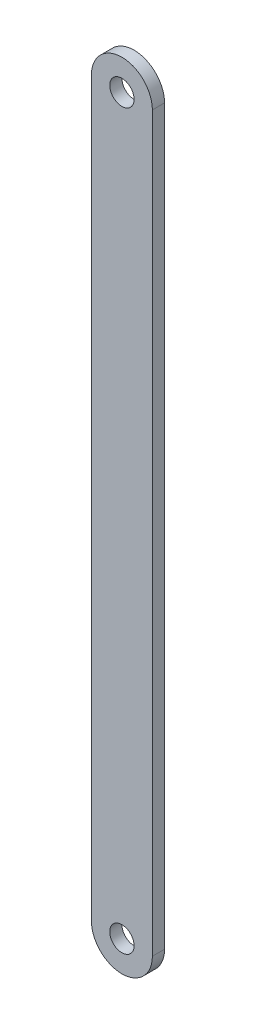
ISO-10303-21;
HEADER;
FILE_DESCRIPTION(('STEP AP214'),'2;1');
FILE_NAME('part.step','',(''),(''),'','','');
FILE_SCHEMA(('AUTOMOTIVE_DESIGN { 1 0 10303 214 1 1 1 1 }'));
ENDSEC;
DATA;
#1=APPLICATION_CONTEXT('core data for automotive mechanical design processes');
#2=APPLICATION_PROTOCOL_DEFINITION('international standard','automotive_design',2000,#1);
#3=PRODUCT_CONTEXT('',#1,'mechanical');
#4=PRODUCT('Part','Part','',(#3));
#5=PRODUCT_RELATED_PRODUCT_CATEGORY('part','',(#4));
#6=PRODUCT_DEFINITION_FORMATION('','',#4);
#7=PRODUCT_DEFINITION_CONTEXT('part definition',#1,'design');
#8=PRODUCT_DEFINITION('design','',#6,#7);
#9=PRODUCT_DEFINITION_SHAPE('','',#8);
#10=(LENGTH_UNIT() NAMED_UNIT(*) SI_UNIT(.MILLI.,.METRE.));
#11=(NAMED_UNIT(*) PLANE_ANGLE_UNIT() SI_UNIT($,.RADIAN.));
#12=(NAMED_UNIT(*) SI_UNIT($,.STERADIAN.) SOLID_ANGLE_UNIT());
#13=UNCERTAINTY_MEASURE_WITH_UNIT(LENGTH_MEASURE(1.E-05),#10,'distance_accuracy_value','');
#14=(GEOMETRIC_REPRESENTATION_CONTEXT(3) GLOBAL_UNCERTAINTY_ASSIGNED_CONTEXT((#13)) GLOBAL_UNIT_ASSIGNED_CONTEXT((#10,
#11,#12)) REPRESENTATION_CONTEXT('',''));
#15=CARTESIAN_POINT('',(0.,0.,0.));
#16=DIRECTION('',(0.,0.,1.));
#17=DIRECTION('',(1.,0.,0.));
#18=AXIS2_PLACEMENT_3D('',#15,#16,#17);
#19=CARTESIAN_POINT('',(25.,0.,10.));
#20=DIRECTION('',(0.,0.,1.));
#21=DIRECTION('',(1.,0.,0.));
#22=AXIS2_PLACEMENT_3D('',#19,#20,#21);
#23=PLANE('',#22);
#24=CARTESIAN_POINT('',(25.,601.7,10.));
#25=DIRECTION('',(0.,0.,1.));
#26=DIRECTION('',(1.,0.,0.));
#27=AXIS2_PLACEMENT_3D('',#24,#25,#26);
#28=CIRCLE('',#27,10.);
#29=CARTESIAN_POINT('',(35.,601.7,10.));
#30=VERTEX_POINT('',#29);
#31=EDGE_CURVE('E100',#30,#30,#28,.T.);
#32=ORIENTED_EDGE('',*,*,#31,.F.);
#33=EDGE_LOOP('',(#32));
#34=FACE_BOUND('',#33,.T.);
#35=CARTESIAN_POINT('',(25.,0.,10.));
#36=DIRECTION('',(0.,0.,1.));
#37=DIRECTION('',(1.,0.,0.));
#38=AXIS2_PLACEMENT_3D('',#35,#36,#37);
#39=CIRCLE('',#38,25.);
#40=CARTESIAN_POINT('',(0.,0.,10.));
#41=VERTEX_POINT('',#40);
#42=CARTESIAN_POINT('',(50.,0.,10.));
#43=VERTEX_POINT('',#42);
#44=EDGE_CURVE('E85',#41,#43,#39,.T.);
#45=ORIENTED_EDGE('',*,*,#44,.T.);
#46=DIRECTION('',(0.,1.,0.));
#47=VECTOR('',#46,1.);
#48=CARTESIAN_POINT('',(50.,0.,10.));
#49=LINE('',#48,#47);
#50=CARTESIAN_POINT('',(50.0000000000001,601.7,10.));
#51=VERTEX_POINT('',#50);
#52=EDGE_CURVE('E80',#43,#51,#49,.T.);
#53=ORIENTED_EDGE('',*,*,#52,.T.);
#54=CARTESIAN_POINT('',(25.,601.7,10.));
#55=DIRECTION('',(0.,0.,1.));
#56=DIRECTION('',(1.,0.,0.));
#57=AXIS2_PLACEMENT_3D('',#54,#55,#56);
#58=CIRCLE('',#57,25.0000000000001);
#59=CARTESIAN_POINT('',(-2.84494650060196E-13,601.7,10.));
#60=VERTEX_POINT('',#59);
#61=EDGE_CURVE('E83',#51,#60,#58,.T.);
#62=ORIENTED_EDGE('',*,*,#61,.T.);
#63=DIRECTION('',(0.,-1.,0.));
#64=VECTOR('',#63,1.);
#65=CARTESIAN_POINT('',(-2.84494650060196E-13,601.7,10.));
#66=LINE('',#65,#64);
#67=EDGE_CURVE('E50',#60,#41,#66,.T.);
#68=ORIENTED_EDGE('',*,*,#67,.T.);
#69=EDGE_LOOP('',(#45,#53,#62,#68));
#70=FACE_BOUND('',#69,.T.);
#71=CARTESIAN_POINT('',(25.,0.,10.));
#72=DIRECTION('',(0.,0.,1.));
#73=DIRECTION('',(1.,0.,0.));
#74=AXIS2_PLACEMENT_3D('',#71,#72,#73);
#75=CIRCLE('',#74,10.);
#76=CARTESIAN_POINT('',(35.,0.,10.));
#77=VERTEX_POINT('',#76);
#78=EDGE_CURVE('E115',#77,#77,#75,.T.);
#79=ORIENTED_EDGE('',*,*,#78,.F.);
#80=EDGE_LOOP('',(#79));
#81=FACE_BOUND('',#80,.T.);
#82=ADVANCED_FACE('F33',(#34,#70,#81),#23,.T.);
#83=CARTESIAN_POINT('',(25.,0.,0.));
#84=DIRECTION('',(0.,0.,1.));
#85=DIRECTION('',(1.,0.,0.));
#86=AXIS2_PLACEMENT_3D('',#83,#84,#85);
#87=PLANE('',#86);
#88=CARTESIAN_POINT('',(25.,601.7,0.));
#89=DIRECTION('',(0.,0.,1.));
#90=DIRECTION('',(1.,0.,0.));
#91=AXIS2_PLACEMENT_3D('',#88,#89,#90);
#92=CIRCLE('',#91,10.);
#93=CARTESIAN_POINT('',(35.,601.7,0.));
#94=VERTEX_POINT('',#93);
#95=EDGE_CURVE('E112',#94,#94,#92,.T.);
#96=ORIENTED_EDGE('',*,*,#95,.T.);
#97=EDGE_LOOP('',(#96));
#98=FACE_BOUND('',#97,.T.);
#99=CARTESIAN_POINT('',(25.,0.,0.));
#100=DIRECTION('',(0.,0.,1.));
#101=DIRECTION('',(1.,0.,0.));
#102=AXIS2_PLACEMENT_3D('',#99,#100,#101);
#103=CIRCLE('',#102,25.);
#104=CARTESIAN_POINT('',(0.,0.,0.));
#105=VERTEX_POINT('',#104);
#106=CARTESIAN_POINT('',(50.,0.,0.));
#107=VERTEX_POINT('',#106);
#108=EDGE_CURVE('E97',#105,#107,#103,.T.);
#109=ORIENTED_EDGE('',*,*,#108,.F.);
#110=DIRECTION('',(0.,-1.,0.));
#111=VECTOR('',#110,1.);
#112=CARTESIAN_POINT('',(-2.84494650060196E-13,601.7,0.));
#113=LINE('',#112,#111);
#114=CARTESIAN_POINT('',(-2.84494650060196E-13,601.7,0.));
#115=VERTEX_POINT('',#114);
#116=EDGE_CURVE('E73',#115,#105,#113,.T.);
#117=ORIENTED_EDGE('',*,*,#116,.F.);
#118=CARTESIAN_POINT('',(25.,601.7,0.));
#119=DIRECTION('',(0.,0.,1.));
#120=DIRECTION('',(1.,0.,0.));
#121=AXIS2_PLACEMENT_3D('',#118,#119,#120);
#122=CIRCLE('',#121,25.0000000000001);
#123=CARTESIAN_POINT('',(50.0000000000001,601.7,0.));
#124=VERTEX_POINT('',#123);
#125=EDGE_CURVE('E67',#124,#115,#122,.T.);
#126=ORIENTED_EDGE('',*,*,#125,.F.);
#127=DIRECTION('',(0.,1.,0.));
#128=VECTOR('',#127,1.);
#129=CARTESIAN_POINT('',(50.,0.,0.));
#130=LINE('',#129,#128);
#131=EDGE_CURVE('E89',#107,#124,#130,.T.);
#132=ORIENTED_EDGE('',*,*,#131,.F.);
#133=EDGE_LOOP('',(#109,#117,#126,#132));
#134=FACE_BOUND('',#133,.T.);
#135=CARTESIAN_POINT('',(25.,0.,0.));
#136=DIRECTION('',(0.,0.,1.));
#137=DIRECTION('',(1.,0.,0.));
#138=AXIS2_PLACEMENT_3D('',#135,#136,#137);
#139=CIRCLE('',#138,10.);
#140=CARTESIAN_POINT('',(35.,0.,0.));
#141=VERTEX_POINT('',#140);
#142=EDGE_CURVE('E118',#141,#141,#139,.T.);
#143=ORIENTED_EDGE('',*,*,#142,.T.);
#144=EDGE_LOOP('',(#143));
#145=FACE_BOUND('',#144,.T.);
#146=ADVANCED_FACE('F108',(#98,#134,#145),#87,.F.);
#147=CARTESIAN_POINT('',(25.,0.,10.));
#148=DIRECTION('',(0.,0.,-1.));
#149=DIRECTION('',(-1.,0.,0.));
#150=AXIS2_PLACEMENT_3D('',#147,#148,#149);
#151=CYLINDRICAL_SURFACE('',#150,25.);
#152=ORIENTED_EDGE('',*,*,#108,.T.);
#153=DIRECTION('',(0.,0.,-1.));
#154=VECTOR('',#153,1.);
#155=CARTESIAN_POINT('',(50.,0.,10.));
#156=LINE('',#155,#154);
#157=EDGE_CURVE('E11',#43,#107,#156,.T.);
#158=ORIENTED_EDGE('',*,*,#157,.F.);
#159=ORIENTED_EDGE('',*,*,#44,.F.);
#160=DIRECTION('',(0.,0.,-1.));
#161=VECTOR('',#160,1.);
#162=CARTESIAN_POINT('',(0.,0.,10.));
#163=LINE('',#162,#161);
#164=EDGE_CURVE('E93',#41,#105,#163,.T.);
#165=ORIENTED_EDGE('',*,*,#164,.T.);
#166=EDGE_LOOP('',(#152,#158,#159,#165));
#167=FACE_BOUND('',#166,.T.);
#168=ADVANCED_FACE('F35',(#167),#151,.T.);
#169=CARTESIAN_POINT('',(50.,0.,10.));
#170=DIRECTION('',(-1.,0.,0.));
#171=DIRECTION('',(0.,-1.,0.));
#172=AXIS2_PLACEMENT_3D('',#169,#170,#171);
#173=PLANE('',#172);
#174=ORIENTED_EDGE('',*,*,#131,.T.);
#175=DIRECTION('',(0.,0.,-1.));
#176=VECTOR('',#175,1.);
#177=CARTESIAN_POINT('',(50.0000000000001,601.7,10.));
#178=LINE('',#177,#176);
#179=EDGE_CURVE('E42',#51,#124,#178,.T.);
#180=ORIENTED_EDGE('',*,*,#179,.F.);
#181=ORIENTED_EDGE('',*,*,#52,.F.);
#182=ORIENTED_EDGE('',*,*,#157,.T.);
#183=EDGE_LOOP('',(#174,#180,#181,#182));
#184=FACE_BOUND('',#183,.T.);
#185=ADVANCED_FACE('F88',(#184),#173,.F.);
#186=CARTESIAN_POINT('',(25.,601.7,10.));
#187=DIRECTION('',(0.,0.,-1.));
#188=DIRECTION('',(-1.,0.,0.));
#189=AXIS2_PLACEMENT_3D('',#186,#187,#188);
#190=CYLINDRICAL_SURFACE('',#189,25.0000000000001);
#191=ORIENTED_EDGE('',*,*,#125,.T.);
#192=DIRECTION('',(0.,0.,-1.));
#193=VECTOR('',#192,1.);
#194=CARTESIAN_POINT('',(-2.84494650060196E-13,601.7,10.));
#195=LINE('',#194,#193);
#196=EDGE_CURVE('E90',#60,#115,#195,.T.);
#197=ORIENTED_EDGE('',*,*,#196,.F.);
#198=ORIENTED_EDGE('',*,*,#61,.F.);
#199=ORIENTED_EDGE('',*,*,#179,.T.);
#200=EDGE_LOOP('',(#191,#197,#198,#199));
#201=FACE_BOUND('',#200,.T.);
#202=ADVANCED_FACE('F91',(#201),#190,.T.);
#203=CARTESIAN_POINT('',(-2.84494650060196E-13,601.7,10.));
#204=DIRECTION('',(1.,0.,0.));
#205=DIRECTION('',(0.,1.,0.));
#206=AXIS2_PLACEMENT_3D('',#203,#204,#205);
#207=PLANE('',#206);
#208=ORIENTED_EDGE('',*,*,#116,.T.);
#209=ORIENTED_EDGE('',*,*,#164,.F.);
#210=ORIENTED_EDGE('',*,*,#67,.F.);
#211=ORIENTED_EDGE('',*,*,#196,.T.);
#212=EDGE_LOOP('',(#208,#209,#210,#211));
#213=FACE_BOUND('',#212,.T.);
#214=ADVANCED_FACE('F105',(#213),#207,.F.);
#215=CARTESIAN_POINT('',(25.,601.7,10.));
#216=DIRECTION('',(0.,0.,-1.));
#217=DIRECTION('',(-1.,0.,0.));
#218=AXIS2_PLACEMENT_3D('',#215,#216,#217);
#219=CYLINDRICAL_SURFACE('',#218,10.);
#220=ORIENTED_EDGE('',*,*,#31,.T.);
#221=EDGE_LOOP('',(#220));
#222=FACE_BOUND('',#221,.T.);
#223=ORIENTED_EDGE('',*,*,#95,.F.);
#224=EDGE_LOOP('',(#223));
#225=FACE_BOUND('',#224,.T.);
#226=ADVANCED_FACE('F136',(#222,#225),#219,.F.);
#227=CARTESIAN_POINT('',(25.,0.,10.));
#228=DIRECTION('',(0.,0.,-1.));
#229=DIRECTION('',(-1.,0.,0.));
#230=AXIS2_PLACEMENT_3D('',#227,#228,#229);
#231=CYLINDRICAL_SURFACE('',#230,10.);
#232=ORIENTED_EDGE('',*,*,#78,.T.);
#233=EDGE_LOOP('',(#232));
#234=FACE_BOUND('',#233,.T.);
#235=ORIENTED_EDGE('',*,*,#142,.F.);
#236=EDGE_LOOP('',(#235));
#237=FACE_BOUND('',#236,.T.);
#238=ADVANCED_FACE('F124',(#234,#237),#231,.F.);
#239=CLOSED_SHELL('',(#82,#146,#168,#185,#202,#214,#226,#238));
#240=MANIFOLD_SOLID_BREP('B2',#239);
#241=ADVANCED_BREP_SHAPE_REPRESENTATION('',(#18,#240),#14);
#242=SHAPE_DEFINITION_REPRESENTATION(#9,#241);
ENDSEC;
END-ISO-10303-21;
